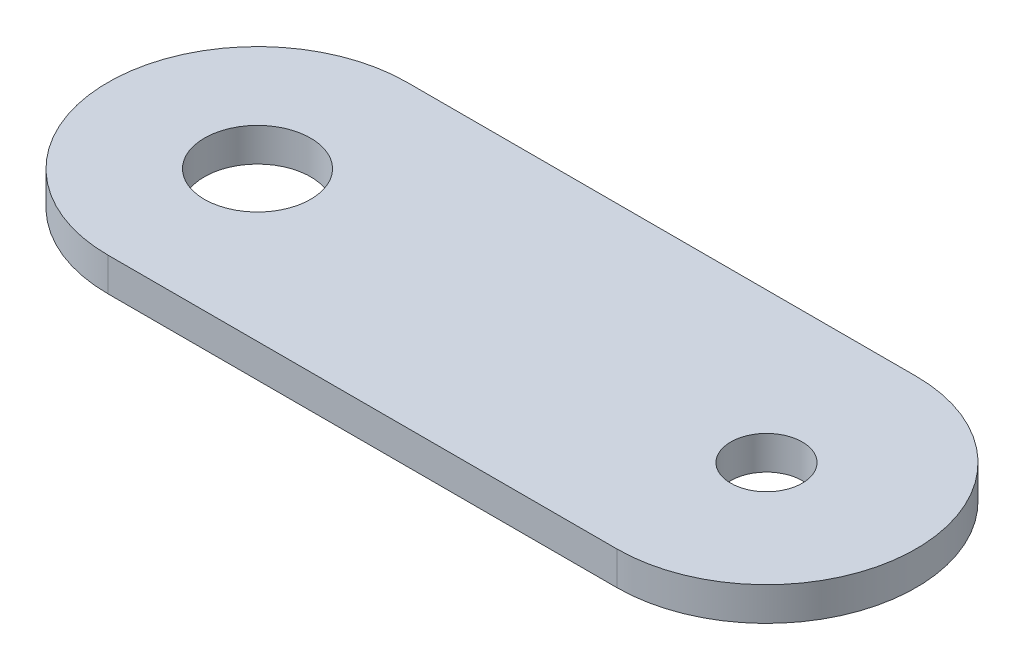
ISO-10303-21;
HEADER;
FILE_DESCRIPTION(('STEP AP214'),'2;1');
FILE_NAME('part.step','',(''),(''),'','','');
FILE_SCHEMA(('AUTOMOTIVE_DESIGN { 1 0 10303 214 1 1 1 1 }'));
ENDSEC;
DATA;
#1=APPLICATION_CONTEXT('core data for automotive mechanical design processes');
#2=APPLICATION_PROTOCOL_DEFINITION('international standard','automotive_design',2000,#1);
#3=PRODUCT_CONTEXT('',#1,'mechanical');
#4=PRODUCT('Part','Part','',(#3));
#5=PRODUCT_RELATED_PRODUCT_CATEGORY('part','',(#4));
#6=PRODUCT_DEFINITION_FORMATION('','',#4);
#7=PRODUCT_DEFINITION_CONTEXT('part definition',#1,'design');
#8=PRODUCT_DEFINITION('design','',#6,#7);
#9=PRODUCT_DEFINITION_SHAPE('','',#8);
#10=(LENGTH_UNIT() NAMED_UNIT(*) SI_UNIT(.MILLI.,.METRE.));
#11=(NAMED_UNIT(*) PLANE_ANGLE_UNIT() SI_UNIT($,.RADIAN.));
#12=(NAMED_UNIT(*) SI_UNIT($,.STERADIAN.) SOLID_ANGLE_UNIT());
#13=UNCERTAINTY_MEASURE_WITH_UNIT(LENGTH_MEASURE(1.E-05),#10,'distance_accuracy_value','');
#14=(GEOMETRIC_REPRESENTATION_CONTEXT(3) GLOBAL_UNCERTAINTY_ASSIGNED_CONTEXT((#13)) GLOBAL_UNIT_ASSIGNED_CONTEXT((#10,
#11,#12)) REPRESENTATION_CONTEXT('',''));
#15=CARTESIAN_POINT('',(0.,0.,0.));
#16=DIRECTION('',(0.,0.,1.));
#17=DIRECTION('',(1.,0.,0.));
#18=AXIS2_PLACEMENT_3D('',#15,#16,#17);
#19=CARTESIAN_POINT('',(0.,4.,17.8414162090544));
#20=DIRECTION('',(0.,0.,-1.));
#21=DIRECTION('',(-1.,0.,0.));
#22=AXIS2_PLACEMENT_3D('',#19,#20,#21);
#23=PLANE('',#22);
#24=DIRECTION('',(1.,0.,0.));
#25=VECTOR('',#24,1.);
#26=CARTESIAN_POINT('',(0.,0.,17.8414162090544));
#27=LINE('',#26,#25);
#28=CARTESIAN_POINT('',(0.,0.,17.8414162090544));
#29=VERTEX_POINT('',#28);
#30=CARTESIAN_POINT('',(60.7047624479461,0.,17.8414162090544));
#31=VERTEX_POINT('',#30);
#32=EDGE_CURVE('E104',#29,#31,#27,.T.);
#33=ORIENTED_EDGE('',*,*,#32,.T.);
#34=DIRECTION('',(0.,-1.,0.));
#35=VECTOR('',#34,1.);
#36=CARTESIAN_POINT('',(60.7047624479461,4.,17.8414162090544));
#37=LINE('',#36,#35);
#38=CARTESIAN_POINT('',(60.7047624479461,4.,17.8414162090544));
#39=VERTEX_POINT('',#38);
#40=EDGE_CURVE('E11',#39,#31,#37,.T.);
#41=ORIENTED_EDGE('',*,*,#40,.F.);
#42=DIRECTION('',(1.,0.,0.));
#43=VECTOR('',#42,1.);
#44=CARTESIAN_POINT('',(0.,4.,17.8414162090544));
#45=LINE('',#44,#43);
#46=CARTESIAN_POINT('',(0.,4.,17.8414162090544));
#47=VERTEX_POINT('',#46);
#48=EDGE_CURVE('E83',#47,#39,#45,.T.);
#49=ORIENTED_EDGE('',*,*,#48,.F.);
#50=DIRECTION('',(0.,-1.,0.));
#51=VECTOR('',#50,1.);
#52=CARTESIAN_POINT('',(0.,4.,17.8414162090544));
#53=LINE('',#52,#51);
#54=EDGE_CURVE('E94',#47,#29,#53,.T.);
#55=ORIENTED_EDGE('',*,*,#54,.T.);
#56=EDGE_LOOP('',(#33,#41,#49,#55));
#57=FACE_BOUND('',#56,.T.);
#58=ADVANCED_FACE('F35',(#57),#23,.F.);
#59=CARTESIAN_POINT('',(60.7047624479461,4.,0.));
#60=DIRECTION('',(0.,-1.,0.));
#61=DIRECTION('',(0.,0.,-1.));
#62=AXIS2_PLACEMENT_3D('',#59,#60,#61);
#63=CYLINDRICAL_SURFACE('',#62,17.8414162090544);
#64=CARTESIAN_POINT('',(60.7047624479461,0.,0.));
#65=DIRECTION('',(0.,1.,0.));
#66=DIRECTION('',(0.,0.,1.));
#67=AXIS2_PLACEMENT_3D('',#64,#65,#66);
#68=CIRCLE('',#67,17.8414162090544);
#69=CARTESIAN_POINT('',(60.7047624479461,0.,-17.8414162090544));
#70=VERTEX_POINT('',#69);
#71=EDGE_CURVE('E88',#31,#70,#68,.T.);
#72=ORIENTED_EDGE('',*,*,#71,.T.);
#73=DIRECTION('',(0.,-1.,0.));
#74=VECTOR('',#73,1.);
#75=CARTESIAN_POINT('',(60.7047624479461,4.,-17.8414162090544));
#76=LINE('',#75,#74);
#77=CARTESIAN_POINT('',(60.7047624479461,4.,-17.8414162090544));
#78=VERTEX_POINT('',#77);
#79=EDGE_CURVE('E44',#78,#70,#76,.T.);
#80=ORIENTED_EDGE('',*,*,#79,.F.);
#81=CARTESIAN_POINT('',(60.7047624479461,4.,0.));
#82=DIRECTION('',(0.,1.,0.));
#83=DIRECTION('',(0.,0.,1.));
#84=AXIS2_PLACEMENT_3D('',#81,#82,#83);
#85=CIRCLE('',#84,17.8414162090544);
#86=EDGE_CURVE('E78',#39,#78,#85,.T.);
#87=ORIENTED_EDGE('',*,*,#86,.F.);
#88=ORIENTED_EDGE('',*,*,#40,.T.);
#89=EDGE_LOOP('',(#72,#80,#87,#88));
#90=FACE_BOUND('',#89,.T.);
#91=ADVANCED_FACE('F87',(#90),#63,.T.);
#92=CARTESIAN_POINT('',(0.,4.,-17.8414162090544));
#93=DIRECTION('',(0.,0.,-1.));
#94=DIRECTION('',(-1.,0.,0.));
#95=AXIS2_PLACEMENT_3D('',#92,#93,#94);
#96=PLANE('',#95);
#97=DIRECTION('',(1.,0.,0.));
#98=VECTOR('',#97,1.);
#99=CARTESIAN_POINT('',(0.,0.,-17.8414162090544));
#100=LINE('',#99,#98);
#101=CARTESIAN_POINT('',(0.,0.,-17.8414162090544));
#102=VERTEX_POINT('',#101);
#103=EDGE_CURVE('E108',#102,#70,#100,.T.);
#104=ORIENTED_EDGE('',*,*,#103,.F.);
#105=DIRECTION('',(0.,-1.,0.));
#106=VECTOR('',#105,1.);
#107=CARTESIAN_POINT('',(0.,4.,-17.8414162090544));
#108=LINE('',#107,#106);
#109=CARTESIAN_POINT('',(0.,4.,-17.8414162090544));
#110=VERTEX_POINT('',#109);
#111=EDGE_CURVE('E68',#110,#102,#108,.T.);
#112=ORIENTED_EDGE('',*,*,#111,.F.);
#113=DIRECTION('',(1.,0.,0.));
#114=VECTOR('',#113,1.);
#115=CARTESIAN_POINT('',(0.,4.,-17.8414162090544));
#116=LINE('',#115,#114);
#117=EDGE_CURVE('E81',#110,#78,#116,.T.);
#118=ORIENTED_EDGE('',*,*,#117,.T.);
#119=ORIENTED_EDGE('',*,*,#79,.T.);
#120=EDGE_LOOP('',(#104,#112,#118,#119));
#121=FACE_BOUND('',#120,.T.);
#122=ADVANCED_FACE('F92',(#121),#96,.T.);
#123=CARTESIAN_POINT('',(0.,4.,0.));
#124=DIRECTION('',(0.,-1.,0.));
#125=DIRECTION('',(0.,0.,-1.));
#126=AXIS2_PLACEMENT_3D('',#123,#124,#125);
#127=CYLINDRICAL_SURFACE('',#126,6.33206985354185);
#128=CARTESIAN_POINT('',(0.,4.,0.));
#129=DIRECTION('',(0.,1.,0.));
#130=DIRECTION('',(0.,0.,1.));
#131=AXIS2_PLACEMENT_3D('',#128,#129,#130);
#132=CIRCLE('',#131,6.33206985354185);
#133=CARTESIAN_POINT('',(0.,4.,6.33206985354185));
#134=VERTEX_POINT('',#133);
#135=EDGE_CURVE('E146',#134,#134,#132,.T.);
#136=ORIENTED_EDGE('',*,*,#135,.T.);
#137=EDGE_LOOP('',(#136));
#138=FACE_BOUND('',#137,.T.);
#139=CARTESIAN_POINT('',(0.,0.,0.));
#140=DIRECTION('',(0.,1.,0.));
#141=DIRECTION('',(0.,0.,1.));
#142=AXIS2_PLACEMENT_3D('',#139,#140,#141);
#143=CIRCLE('',#142,6.33206985354185);
#144=CARTESIAN_POINT('',(0.,0.,6.33206985354185));
#145=VERTEX_POINT('',#144);
#146=EDGE_CURVE('E101',#145,#145,#143,.T.);
#147=ORIENTED_EDGE('',*,*,#146,.F.);
#148=EDGE_LOOP('',(#147));
#149=FACE_BOUND('',#148,.T.);
#150=ADVANCED_FACE('F135',(#138,#149),#127,.F.);
#151=CARTESIAN_POINT('',(60.7047624479461,4.,0.));
#152=DIRECTION('',(0.,-1.,0.));
#153=DIRECTION('',(0.,0.,-1.));
#154=AXIS2_PLACEMENT_3D('',#151,#152,#153);
#155=CYLINDRICAL_SURFACE('',#154,4.26542286930217);
#156=CARTESIAN_POINT('',(60.7047624479461,4.,0.));
#157=DIRECTION('',(0.,1.,0.));
#158=DIRECTION('',(0.,0.,1.));
#159=AXIS2_PLACEMENT_3D('',#156,#157,#158);
#160=CIRCLE('',#159,4.26542286930217);
#161=CARTESIAN_POINT('',(60.7047624479461,4.,4.26542286930217));
#162=VERTEX_POINT('',#161);
#163=EDGE_CURVE('E111',#162,#162,#160,.T.);
#164=ORIENTED_EDGE('',*,*,#163,.T.);
#165=EDGE_LOOP('',(#164));
#166=FACE_BOUND('',#165,.T.);
#167=CARTESIAN_POINT('',(60.7047624479461,0.,0.));
#168=DIRECTION('',(0.,1.,0.));
#169=DIRECTION('',(0.,0.,1.));
#170=AXIS2_PLACEMENT_3D('',#167,#168,#169);
#171=CIRCLE('',#170,4.26542286930217);
#172=CARTESIAN_POINT('',(60.7047624479461,0.,4.26542286930217));
#173=VERTEX_POINT('',#172);
#174=EDGE_CURVE('E98',#173,#173,#171,.T.);
#175=ORIENTED_EDGE('',*,*,#174,.F.);
#176=EDGE_LOOP('',(#175));
#177=FACE_BOUND('',#176,.T.);
#178=ADVANCED_FACE('F37',(#166,#177),#155,.F.);
#179=CARTESIAN_POINT('',(0.,4.,0.));
#180=DIRECTION('',(0.,-1.,0.));
#181=DIRECTION('',(0.,0.,-1.));
#182=AXIS2_PLACEMENT_3D('',#179,#180,#181);
#183=CYLINDRICAL_SURFACE('',#182,17.8414162090544);
#184=CARTESIAN_POINT('',(0.,0.,0.));
#185=DIRECTION('',(0.,1.,0.));
#186=DIRECTION('',(0.,0.,1.));
#187=AXIS2_PLACEMENT_3D('',#184,#185,#186);
#188=CIRCLE('',#187,17.8414162090544);
#189=EDGE_CURVE('E71',#102,#29,#188,.T.);
#190=ORIENTED_EDGE('',*,*,#189,.T.);
#191=ORIENTED_EDGE('',*,*,#54,.F.);
#192=CARTESIAN_POINT('',(0.,4.,0.));
#193=DIRECTION('',(0.,1.,0.));
#194=DIRECTION('',(0.,0.,1.));
#195=AXIS2_PLACEMENT_3D('',#192,#193,#194);
#196=CIRCLE('',#195,17.8414162090544);
#197=EDGE_CURVE('E52',#110,#47,#196,.T.);
#198=ORIENTED_EDGE('',*,*,#197,.F.);
#199=ORIENTED_EDGE('',*,*,#111,.T.);
#200=EDGE_LOOP('',(#190,#191,#198,#199));
#201=FACE_BOUND('',#200,.T.);
#202=ADVANCED_FACE('F123',(#201),#183,.T.);
#203=CARTESIAN_POINT('',(0.,4.,0.));
#204=DIRECTION('',(0.,1.,0.));
#205=DIRECTION('',(0.,0.,1.));
#206=AXIS2_PLACEMENT_3D('',#203,#204,#205);
#207=PLANE('',#206);
#208=ORIENTED_EDGE('',*,*,#163,.F.);
#209=EDGE_LOOP('',(#208));
#210=FACE_BOUND('',#209,.T.);
#211=ORIENTED_EDGE('',*,*,#135,.F.);
#212=EDGE_LOOP('',(#211));
#213=FACE_BOUND('',#212,.T.);
#214=ORIENTED_EDGE('',*,*,#48,.T.);
#215=ORIENTED_EDGE('',*,*,#86,.T.);
#216=ORIENTED_EDGE('',*,*,#117,.F.);
#217=ORIENTED_EDGE('',*,*,#197,.T.);
#218=EDGE_LOOP('',(#214,#215,#216,#217));
#219=FACE_BOUND('',#218,.T.);
#220=ADVANCED_FACE('F79',(#210,#213,#219),#207,.T.);
#221=CARTESIAN_POINT('',(0.,0.,0.));
#222=DIRECTION('',(0.,1.,0.));
#223=DIRECTION('',(0.,0.,1.));
#224=AXIS2_PLACEMENT_3D('',#221,#222,#223);
#225=PLANE('',#224);
#226=ORIENTED_EDGE('',*,*,#174,.T.);
#227=EDGE_LOOP('',(#226));
#228=FACE_BOUND('',#227,.T.);
#229=ORIENTED_EDGE('',*,*,#146,.T.);
#230=EDGE_LOOP('',(#229));
#231=FACE_BOUND('',#230,.T.);
#232=ORIENTED_EDGE('',*,*,#32,.F.);
#233=ORIENTED_EDGE('',*,*,#189,.F.);
#234=ORIENTED_EDGE('',*,*,#103,.T.);
#235=ORIENTED_EDGE('',*,*,#71,.F.);
#236=EDGE_LOOP('',(#232,#233,#234,#235));
#237=FACE_BOUND('',#236,.T.);
#238=ADVANCED_FACE('F116',(#228,#231,#237),#225,.F.);
#239=CLOSED_SHELL('',(#58,#91,#122,#150,#178,#202,#220,#238));
#240=MANIFOLD_SOLID_BREP('B2',#239);
#241=ADVANCED_BREP_SHAPE_REPRESENTATION('',(#18,#240),#14);
#242=SHAPE_DEFINITION_REPRESENTATION(#9,#241);
ENDSEC;
END-ISO-10303-21;
